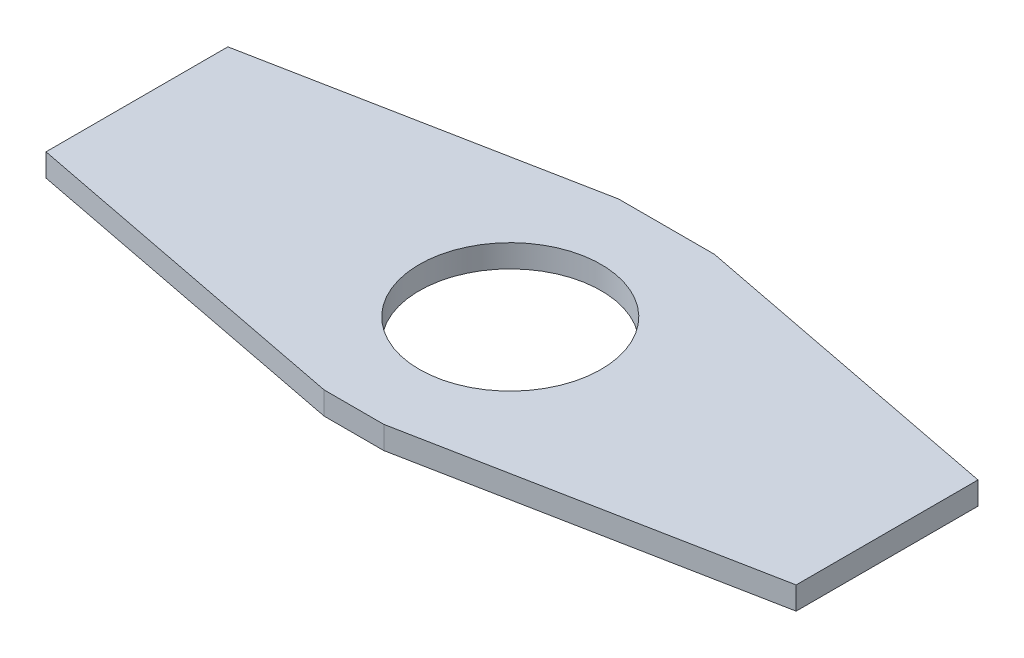
ISO-10303-21;
HEADER;
FILE_DESCRIPTION(('STEP AP214'),'2;1');
FILE_NAME('part.step','',(''),(''),'','','');
FILE_SCHEMA(('AUTOMOTIVE_DESIGN { 1 0 10303 214 1 1 1 1 }'));
ENDSEC;
DATA;
#1=APPLICATION_CONTEXT('core data for automotive mechanical design processes');
#2=APPLICATION_PROTOCOL_DEFINITION('international standard','automotive_design',2000,#1);
#3=PRODUCT_CONTEXT('',#1,'mechanical');
#4=PRODUCT('Part','Part','',(#3));
#5=PRODUCT_RELATED_PRODUCT_CATEGORY('part','',(#4));
#6=PRODUCT_DEFINITION_FORMATION('','',#4);
#7=PRODUCT_DEFINITION_CONTEXT('part definition',#1,'design');
#8=PRODUCT_DEFINITION('design','',#6,#7);
#9=PRODUCT_DEFINITION_SHAPE('','',#8);
#10=(LENGTH_UNIT() NAMED_UNIT(*) SI_UNIT(.MILLI.,.METRE.));
#11=(NAMED_UNIT(*) PLANE_ANGLE_UNIT() SI_UNIT($,.RADIAN.));
#12=(NAMED_UNIT(*) SI_UNIT($,.STERADIAN.) SOLID_ANGLE_UNIT());
#13=UNCERTAINTY_MEASURE_WITH_UNIT(LENGTH_MEASURE(1.E-05),#10,'distance_accuracy_value','');
#14=(GEOMETRIC_REPRESENTATION_CONTEXT(3) GLOBAL_UNCERTAINTY_ASSIGNED_CONTEXT((#13)) GLOBAL_UNIT_ASSIGNED_CONTEXT((#10,
#11,#12)) REPRESENTATION_CONTEXT('',''));
#15=CARTESIAN_POINT('',(0.,0.,0.));
#16=DIRECTION('',(0.,0.,1.));
#17=DIRECTION('',(1.,0.,0.));
#18=AXIS2_PLACEMENT_3D('',#15,#16,#17);
#19=CARTESIAN_POINT('',(0.,4.,0.));
#20=DIRECTION('',(0.,1.,0.));
#21=DIRECTION('',(0.,0.,1.));
#22=AXIS2_PLACEMENT_3D('',#19,#20,#21);
#23=PLANE('',#22);
#24=DIRECTION('',(-0.981627183447664,0.,0.190808995376546));
#25=VECTOR('',#24,1.);
#26=CARTESIAN_POINT('',(-8.42525763268783,4.,-27.5));
#27=LINE('',#26,#25);
#28=CARTESIAN_POINT('',(-8.42525763268783,4.,-27.5));
#29=VERTEX_POINT('',#28);
#30=CARTESIAN_POINT('',(-66.,4.,-16.3086037801173));
#31=VERTEX_POINT('',#30);
#32=EDGE_CURVE('E144',#29,#31,#27,.T.);
#33=ORIENTED_EDGE('',*,*,#32,.T.);
#34=DIRECTION('',(0.,0.,1.));
#35=VECTOR('',#34,1.);
#36=CARTESIAN_POINT('',(-66.,4.,-16.3086037801173));
#37=LINE('',#36,#35);
#38=CARTESIAN_POINT('',(-66.,4.,15.6913962198827));
#39=VERTEX_POINT('',#38);
#40=EDGE_CURVE('E92',#31,#39,#37,.T.);
#41=ORIENTED_EDGE('',*,*,#40,.T.);
#42=DIRECTION('',(0.981627183447664,0.,0.190808995376545));
#43=VECTOR('',#42,1.);
#44=CARTESIAN_POINT('',(-66.,4.,15.6913962198827));
#45=LINE('',#44,#43);
#46=CARTESIAN_POINT('',(-5.24999999999561,4.,27.5));
#47=VERTEX_POINT('',#46);
#48=EDGE_CURVE('E159',#39,#47,#45,.T.);
#49=ORIENTED_EDGE('',*,*,#48,.T.);
#50=DIRECTION('',(1.,0.,0.));
#51=VECTOR('',#50,1.);
#52=CARTESIAN_POINT('',(-5.24999999999561,4.,27.5));
#53=LINE('',#52,#51);
#54=CARTESIAN_POINT('',(5.2500000000001,4.,27.5));
#55=VERTEX_POINT('',#54);
#56=EDGE_CURVE('E172',#47,#55,#53,.T.);
#57=ORIENTED_EDGE('',*,*,#56,.T.);
#58=DIRECTION('',(0.981627183447664,0.,-0.190808995376545));
#59=VECTOR('',#58,1.);
#60=CARTESIAN_POINT('',(66.0000000000045,4.,15.6913962198827));
#61=LINE('',#60,#59);
#62=CARTESIAN_POINT('',(66.0000000000045,4.,15.6913962198827));
#63=VERTEX_POINT('',#62);
#64=EDGE_CURVE('E111',#55,#63,#61,.T.);
#65=ORIENTED_EDGE('',*,*,#64,.T.);
#66=DIRECTION('',(0.,0.,-1.));
#67=VECTOR('',#66,1.);
#68=CARTESIAN_POINT('',(66.0000000000045,4.,-16.3086037801173));
#69=LINE('',#68,#67);
#70=CARTESIAN_POINT('',(66.0000000000045,4.,-16.3086037801173));
#71=VERTEX_POINT('',#70);
#72=EDGE_CURVE('E105',#63,#71,#69,.T.);
#73=ORIENTED_EDGE('',*,*,#72,.T.);
#74=DIRECTION('',(-0.981627183447664,0.,-0.190808995376546));
#75=VECTOR('',#74,1.);
#76=CARTESIAN_POINT('',(8.42525763269232,4.,-27.5));
#77=LINE('',#76,#75);
#78=CARTESIAN_POINT('',(8.42525763269232,4.,-27.5));
#79=VERTEX_POINT('',#78);
#80=EDGE_CURVE('E109',#71,#79,#77,.T.);
#81=ORIENTED_EDGE('',*,*,#80,.T.);
#82=DIRECTION('',(-1.,0.,0.));
#83=VECTOR('',#82,1.);
#84=CARTESIAN_POINT('',(8.42525763269232,4.,-27.5));
#85=LINE('',#84,#83);
#86=EDGE_CURVE('E49',#79,#29,#85,.T.);
#87=ORIENTED_EDGE('',*,*,#86,.T.);
#88=EDGE_LOOP('',(#33,#41,#49,#57,#65,#73,#81,#87));
#89=FACE_BOUND('',#88,.T.);
#90=CARTESIAN_POINT('',(0.,4.,0.));
#91=DIRECTION('',(0.,1.,0.));
#92=DIRECTION('',(0.,0.,1.));
#93=AXIS2_PLACEMENT_3D('',#90,#91,#92);
#94=CIRCLE('',#93,16.);
#95=CARTESIAN_POINT('',(0.,4.,16.));
#96=VERTEX_POINT('',#95);
#97=EDGE_CURVE('E133',#96,#96,#94,.T.);
#98=ORIENTED_EDGE('',*,*,#97,.F.);
#99=EDGE_LOOP('',(#98));
#100=FACE_BOUND('',#99,.T.);
#101=ADVANCED_FACE('F32',(#89,#100),#23,.T.);
#102=CARTESIAN_POINT('',(0.,0.,0.));
#103=DIRECTION('',(0.,1.,0.));
#104=DIRECTION('',(0.,0.,1.));
#105=AXIS2_PLACEMENT_3D('',#102,#103,#104);
#106=PLANE('',#105);
#107=DIRECTION('',(-0.981627183447664,0.,0.190808995376546));
#108=VECTOR('',#107,1.);
#109=CARTESIAN_POINT('',(-8.42525763268783,0.,-27.5));
#110=LINE('',#109,#108);
#111=CARTESIAN_POINT('',(-8.42525763268783,0.,-27.5));
#112=VERTEX_POINT('',#111);
#113=CARTESIAN_POINT('',(-66.,0.,-16.3086037801173));
#114=VERTEX_POINT('',#113);
#115=EDGE_CURVE('E129',#112,#114,#110,.T.);
#116=ORIENTED_EDGE('',*,*,#115,.F.);
#117=DIRECTION('',(-1.,0.,0.));
#118=VECTOR('',#117,1.);
#119=CARTESIAN_POINT('',(8.42525763269232,0.,-27.5));
#120=LINE('',#119,#118);
#121=CARTESIAN_POINT('',(8.42525763269232,0.,-27.5));
#122=VERTEX_POINT('',#121);
#123=EDGE_CURVE('E84',#122,#112,#120,.T.);
#124=ORIENTED_EDGE('',*,*,#123,.F.);
#125=DIRECTION('',(-0.981627183447664,0.,-0.190808995376546));
#126=VECTOR('',#125,1.);
#127=CARTESIAN_POINT('',(8.42525763269232,0.,-27.5));
#128=LINE('',#127,#126);
#129=CARTESIAN_POINT('',(66.0000000000045,0.,-16.3086037801173));
#130=VERTEX_POINT('',#129);
#131=EDGE_CURVE('E78',#130,#122,#128,.T.);
#132=ORIENTED_EDGE('',*,*,#131,.F.);
#133=DIRECTION('',(0.,0.,-1.));
#134=VECTOR('',#133,1.);
#135=CARTESIAN_POINT('',(66.0000000000045,0.,-16.3086037801173));
#136=LINE('',#135,#134);
#137=CARTESIAN_POINT('',(66.0000000000045,0.,15.6913962198827));
#138=VERTEX_POINT('',#137);
#139=EDGE_CURVE('E119',#138,#130,#136,.T.);
#140=ORIENTED_EDGE('',*,*,#139,.F.);
#141=DIRECTION('',(0.981627183447664,0.,-0.190808995376545));
#142=VECTOR('',#141,1.);
#143=CARTESIAN_POINT('',(66.0000000000045,0.,15.6913962198827));
#144=LINE('',#143,#142);
#145=CARTESIAN_POINT('',(5.2500000000001,0.,27.5));
#146=VERTEX_POINT('',#145);
#147=EDGE_CURVE('E139',#146,#138,#144,.T.);
#148=ORIENTED_EDGE('',*,*,#147,.F.);
#149=DIRECTION('',(1.,0.,0.));
#150=VECTOR('',#149,1.);
#151=CARTESIAN_POINT('',(-5.24999999999561,0.,27.5));
#152=LINE('',#151,#150);
#153=CARTESIAN_POINT('',(-5.24999999999561,0.,27.5));
#154=VERTEX_POINT('',#153);
#155=EDGE_CURVE('E137',#154,#146,#152,.T.);
#156=ORIENTED_EDGE('',*,*,#155,.F.);
#157=DIRECTION('',(0.981627183447664,0.,0.190808995376545));
#158=VECTOR('',#157,1.);
#159=CARTESIAN_POINT('',(-66.,0.,15.6913962198827));
#160=LINE('',#159,#158);
#161=CARTESIAN_POINT('',(-66.,0.,15.6913962198827));
#162=VERTEX_POINT('',#161);
#163=EDGE_CURVE('E135',#162,#154,#160,.T.);
#164=ORIENTED_EDGE('',*,*,#163,.F.);
#165=DIRECTION('',(0.,0.,1.));
#166=VECTOR('',#165,1.);
#167=CARTESIAN_POINT('',(-66.,0.,-16.3086037801173));
#168=LINE('',#167,#166);
#169=EDGE_CURVE('E132',#114,#162,#168,.T.);
#170=ORIENTED_EDGE('',*,*,#169,.F.);
#171=EDGE_LOOP('',(#116,#124,#132,#140,#148,#156,#164,#170));
#172=FACE_BOUND('',#171,.T.);
#173=CARTESIAN_POINT('',(0.,0.,0.));
#174=DIRECTION('',(0.,1.,0.));
#175=DIRECTION('',(0.,0.,1.));
#176=AXIS2_PLACEMENT_3D('',#173,#174,#175);
#177=CIRCLE('',#176,16.);
#178=CARTESIAN_POINT('',(0.,0.,16.));
#179=VERTEX_POINT('',#178);
#180=EDGE_CURVE('E178',#179,#179,#177,.T.);
#181=ORIENTED_EDGE('',*,*,#180,.T.);
#182=EDGE_LOOP('',(#181));
#183=FACE_BOUND('',#182,.T.);
#184=ADVANCED_FACE('F163',(#172,#183),#106,.F.);
#185=CARTESIAN_POINT('',(-8.42525763268783,4.,-27.5));
#186=DIRECTION('',(0.190808995376546,0.,0.981627183447664));
#187=DIRECTION('',(0.981627183447664,0.,-0.190808995376546));
#188=AXIS2_PLACEMENT_3D('',#185,#186,#187);
#189=PLANE('',#188);
#190=ORIENTED_EDGE('',*,*,#115,.T.);
#191=DIRECTION('',(0.,-1.,0.));
#192=VECTOR('',#191,1.);
#193=CARTESIAN_POINT('',(-66.,4.,-16.3086037801173));
#194=LINE('',#193,#192);
#195=EDGE_CURVE('E11',#31,#114,#194,.T.);
#196=ORIENTED_EDGE('',*,*,#195,.F.);
#197=ORIENTED_EDGE('',*,*,#32,.F.);
#198=DIRECTION('',(0.,-1.,0.));
#199=VECTOR('',#198,1.);
#200=CARTESIAN_POINT('',(-8.42525763268783,4.,-27.5));
#201=LINE('',#200,#199);
#202=EDGE_CURVE('E125',#29,#112,#201,.T.);
#203=ORIENTED_EDGE('',*,*,#202,.T.);
#204=EDGE_LOOP('',(#190,#196,#197,#203));
#205=FACE_BOUND('',#204,.T.);
#206=ADVANCED_FACE('F34',(#205),#189,.F.);
#207=CARTESIAN_POINT('',(-66.,4.,-16.3086037801173));
#208=DIRECTION('',(1.,0.,0.));
#209=DIRECTION('',(0.,0.,-1.));
#210=AXIS2_PLACEMENT_3D('',#207,#208,#209);
#211=PLANE('',#210);
#212=ORIENTED_EDGE('',*,*,#169,.T.);
#213=DIRECTION('',(0.,-1.,0.));
#214=VECTOR('',#213,1.);
#215=CARTESIAN_POINT('',(-66.,4.,15.6913962198827));
#216=LINE('',#215,#214);
#217=EDGE_CURVE('E41',#39,#162,#216,.T.);
#218=ORIENTED_EDGE('',*,*,#217,.F.);
#219=ORIENTED_EDGE('',*,*,#40,.F.);
#220=ORIENTED_EDGE('',*,*,#195,.T.);
#221=EDGE_LOOP('',(#212,#218,#219,#220));
#222=FACE_BOUND('',#221,.T.);
#223=ADVANCED_FACE('F206',(#222),#211,.F.);
#224=CARTESIAN_POINT('',(-66.,4.,15.6913962198827));
#225=DIRECTION('',(0.190808995376545,0.,-0.981627183447664));
#226=DIRECTION('',(-0.981627183447664,0.,-0.190808995376545));
#227=AXIS2_PLACEMENT_3D('',#224,#225,#226);
#228=PLANE('',#227);
#229=ORIENTED_EDGE('',*,*,#163,.T.);
#230=DIRECTION('',(0.,-1.,0.));
#231=VECTOR('',#230,1.);
#232=CARTESIAN_POINT('',(-5.24999999999561,4.,27.5));
#233=LINE('',#232,#231);
#234=EDGE_CURVE('E151',#47,#154,#233,.T.);
#235=ORIENTED_EDGE('',*,*,#234,.F.);
#236=ORIENTED_EDGE('',*,*,#48,.F.);
#237=ORIENTED_EDGE('',*,*,#217,.T.);
#238=EDGE_LOOP('',(#229,#235,#236,#237));
#239=FACE_BOUND('',#238,.T.);
#240=ADVANCED_FACE('F157',(#239),#228,.F.);
#241=CARTESIAN_POINT('',(-5.24999999999561,4.,27.5));
#242=DIRECTION('',(0.,0.,-1.));
#243=DIRECTION('',(-1.,0.,0.));
#244=AXIS2_PLACEMENT_3D('',#241,#242,#243);
#245=PLANE('',#244);
#246=ORIENTED_EDGE('',*,*,#155,.T.);
#247=DIRECTION('',(0.,-1.,0.));
#248=VECTOR('',#247,1.);
#249=CARTESIAN_POINT('',(5.2500000000001,4.,27.5));
#250=LINE('',#249,#248);
#251=EDGE_CURVE('E148',#55,#146,#250,.T.);
#252=ORIENTED_EDGE('',*,*,#251,.F.);
#253=ORIENTED_EDGE('',*,*,#56,.F.);
#254=ORIENTED_EDGE('',*,*,#234,.T.);
#255=EDGE_LOOP('',(#246,#252,#253,#254));
#256=FACE_BOUND('',#255,.T.);
#257=ADVANCED_FACE('F168',(#256),#245,.F.);
#258=CARTESIAN_POINT('',(66.0000000000045,4.,15.6913962198827));
#259=DIRECTION('',(-0.190808995376545,0.,-0.981627183447664));
#260=DIRECTION('',(-0.981627183447664,0.,0.190808995376545));
#261=AXIS2_PLACEMENT_3D('',#258,#259,#260);
#262=PLANE('',#261);
#263=ORIENTED_EDGE('',*,*,#147,.T.);
#264=DIRECTION('',(0.,-1.,0.));
#265=VECTOR('',#264,1.);
#266=CARTESIAN_POINT('',(66.0000000000045,4.,15.6913962198827));
#267=LINE('',#266,#265);
#268=EDGE_CURVE('E120',#63,#138,#267,.T.);
#269=ORIENTED_EDGE('',*,*,#268,.F.);
#270=ORIENTED_EDGE('',*,*,#64,.F.);
#271=ORIENTED_EDGE('',*,*,#251,.T.);
#272=EDGE_LOOP('',(#263,#269,#270,#271));
#273=FACE_BOUND('',#272,.T.);
#274=ADVANCED_FACE('F171',(#273),#262,.F.);
#275=CARTESIAN_POINT('',(66.0000000000045,4.,-16.3086037801173));
#276=DIRECTION('',(-1.,0.,0.));
#277=DIRECTION('',(0.,0.,1.));
#278=AXIS2_PLACEMENT_3D('',#275,#276,#277);
#279=PLANE('',#278);
#280=ORIENTED_EDGE('',*,*,#139,.T.);
#281=DIRECTION('',(0.,-1.,0.));
#282=VECTOR('',#281,1.);
#283=CARTESIAN_POINT('',(66.0000000000045,4.,-16.3086037801173));
#284=LINE('',#283,#282);
#285=EDGE_CURVE('E116',#71,#130,#284,.T.);
#286=ORIENTED_EDGE('',*,*,#285,.F.);
#287=ORIENTED_EDGE('',*,*,#72,.F.);
#288=ORIENTED_EDGE('',*,*,#268,.T.);
#289=EDGE_LOOP('',(#280,#286,#287,#288));
#290=FACE_BOUND('',#289,.T.);
#291=ADVANCED_FACE('F117',(#290),#279,.F.);
#292=CARTESIAN_POINT('',(8.42525763269232,4.,-27.5));
#293=DIRECTION('',(-0.190808995376546,0.,0.981627183447664));
#294=DIRECTION('',(0.981627183447664,0.,0.190808995376546));
#295=AXIS2_PLACEMENT_3D('',#292,#293,#294);
#296=PLANE('',#295);
#297=ORIENTED_EDGE('',*,*,#131,.T.);
#298=DIRECTION('',(0.,-1.,0.));
#299=VECTOR('',#298,1.);
#300=CARTESIAN_POINT('',(8.42525763269232,4.,-27.5));
#301=LINE('',#300,#299);
#302=EDGE_CURVE('E121',#79,#122,#301,.T.);
#303=ORIENTED_EDGE('',*,*,#302,.F.);
#304=ORIENTED_EDGE('',*,*,#80,.F.);
#305=ORIENTED_EDGE('',*,*,#285,.T.);
#306=EDGE_LOOP('',(#297,#303,#304,#305));
#307=FACE_BOUND('',#306,.T.);
#308=ADVANCED_FACE('F123',(#307),#296,.F.);
#309=CARTESIAN_POINT('',(8.42525763269232,4.,-27.5));
#310=DIRECTION('',(0.,0.,1.));
#311=DIRECTION('',(1.,0.,0.));
#312=AXIS2_PLACEMENT_3D('',#309,#310,#311);
#313=PLANE('',#312);
#314=ORIENTED_EDGE('',*,*,#123,.T.);
#315=ORIENTED_EDGE('',*,*,#202,.F.);
#316=ORIENTED_EDGE('',*,*,#86,.F.);
#317=ORIENTED_EDGE('',*,*,#302,.T.);
#318=EDGE_LOOP('',(#314,#315,#316,#317));
#319=FACE_BOUND('',#318,.T.);
#320=ADVANCED_FACE('F194',(#319),#313,.F.);
#321=CARTESIAN_POINT('',(0.,4.,0.));
#322=DIRECTION('',(0.,-1.,0.));
#323=DIRECTION('',(0.,0.,-1.));
#324=AXIS2_PLACEMENT_3D('',#321,#322,#323);
#325=CYLINDRICAL_SURFACE('',#324,16.);
#326=ORIENTED_EDGE('',*,*,#97,.T.);
#327=EDGE_LOOP('',(#326));
#328=FACE_BOUND('',#327,.T.);
#329=ORIENTED_EDGE('',*,*,#180,.F.);
#330=EDGE_LOOP('',(#329));
#331=FACE_BOUND('',#330,.T.);
#332=ADVANCED_FACE('F184',(#328,#331),#325,.F.);
#333=CLOSED_SHELL('',(#101,#184,#206,#223,#240,#257,#274,#291,#308,#320,#332));
#334=MANIFOLD_SOLID_BREP('B2',#333);
#335=ADVANCED_BREP_SHAPE_REPRESENTATION('',(#18,#334),#14);
#336=SHAPE_DEFINITION_REPRESENTATION(#9,#335);
ENDSEC;
END-ISO-10303-21;
